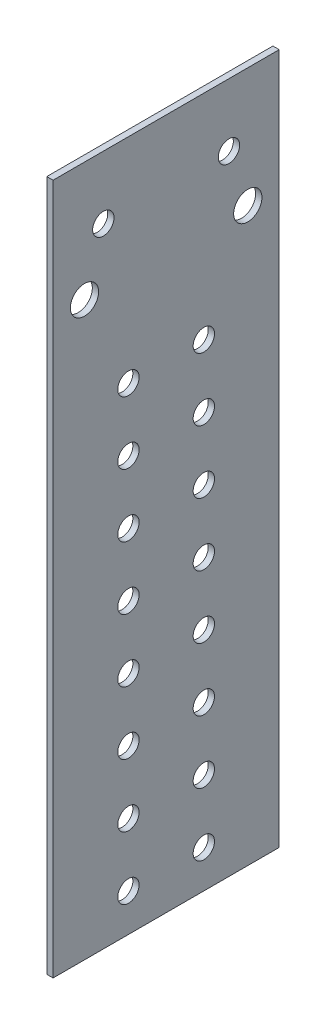
ISO-10303-21;
HEADER;
FILE_DESCRIPTION(('STEP AP214'),'2;1');
FILE_NAME('part.step','',(''),(''),'','','');
FILE_SCHEMA(('AUTOMOTIVE_DESIGN { 1 0 10303 214 1 1 1 1 }'));
ENDSEC;
DATA;
#1=APPLICATION_CONTEXT('core data for automotive mechanical design processes');
#2=APPLICATION_PROTOCOL_DEFINITION('international standard','automotive_design',2000,#1);
#3=PRODUCT_CONTEXT('',#1,'mechanical');
#4=PRODUCT('Part','Part','',(#3));
#5=PRODUCT_RELATED_PRODUCT_CATEGORY('part','',(#4));
#6=PRODUCT_DEFINITION_FORMATION('','',#4);
#7=PRODUCT_DEFINITION_CONTEXT('part definition',#1,'design');
#8=PRODUCT_DEFINITION('design','',#6,#7);
#9=PRODUCT_DEFINITION_SHAPE('','',#8);
#10=(LENGTH_UNIT() NAMED_UNIT(*) SI_UNIT(.MILLI.,.METRE.));
#11=(NAMED_UNIT(*) PLANE_ANGLE_UNIT() SI_UNIT($,.RADIAN.));
#12=(NAMED_UNIT(*) SI_UNIT($,.STERADIAN.) SOLID_ANGLE_UNIT());
#13=UNCERTAINTY_MEASURE_WITH_UNIT(LENGTH_MEASURE(1.E-05),#10,'distance_accuracy_value','');
#14=(GEOMETRIC_REPRESENTATION_CONTEXT(3) GLOBAL_UNCERTAINTY_ASSIGNED_CONTEXT((#13)) GLOBAL_UNIT_ASSIGNED_CONTEXT((#10,
#11,#12)) REPRESENTATION_CONTEXT('',''));
#15=CARTESIAN_POINT('',(0.,0.,0.));
#16=DIRECTION('',(0.,0.,1.));
#17=DIRECTION('',(1.,0.,0.));
#18=AXIS2_PLACEMENT_3D('',#15,#16,#17);
#19=CARTESIAN_POINT('',(1.,0.,18.));
#20=DIRECTION('',(0.,1.,0.));
#21=DIRECTION('',(0.,0.,1.));
#22=AXIS2_PLACEMENT_3D('',#19,#20,#21);
#23=PLANE('',#22);
#24=DIRECTION('',(0.,0.,-1.));
#25=VECTOR('',#24,1.);
#26=CARTESIAN_POINT('',(0.,0.,18.));
#27=LINE('',#26,#25);
#28=CARTESIAN_POINT('',(0.,0.,18.));
#29=VERTEX_POINT('',#28);
#30=CARTESIAN_POINT('',(0.,0.,-18.));
#31=VERTEX_POINT('',#30);
#32=EDGE_CURVE('E100',#29,#31,#27,.T.);
#33=ORIENTED_EDGE('',*,*,#32,.F.);
#34=DIRECTION('',(-1.,0.,0.));
#35=VECTOR('',#34,1.);
#36=CARTESIAN_POINT('',(1.,0.,18.));
#37=LINE('',#36,#35);
#38=CARTESIAN_POINT('',(1.,0.,18.));
#39=VERTEX_POINT('',#38);
#40=EDGE_CURVE('E11',#39,#29,#37,.T.);
#41=ORIENTED_EDGE('',*,*,#40,.F.);
#42=DIRECTION('',(0.,0.,-1.));
#43=VECTOR('',#42,1.);
#44=CARTESIAN_POINT('',(1.,0.,18.));
#45=LINE('',#44,#43);
#46=CARTESIAN_POINT('',(1.,0.,-18.));
#47=VERTEX_POINT('',#46);
#48=EDGE_CURVE('E94',#39,#47,#45,.T.);
#49=ORIENTED_EDGE('',*,*,#48,.T.);
#50=DIRECTION('',(-1.,0.,0.));
#51=VECTOR('',#50,1.);
#52=CARTESIAN_POINT('',(1.,0.,-18.));
#53=LINE('',#52,#51);
#54=EDGE_CURVE('E37',#47,#31,#53,.T.);
#55=ORIENTED_EDGE('',*,*,#54,.T.);
#56=EDGE_LOOP('',(#33,#41,#49,#55));
#57=FACE_BOUND('',#56,.T.);
#58=ADVANCED_FACE('F34',(#57),#23,.T.);
#59=CARTESIAN_POINT('',(1.,0.,18.));
#60=DIRECTION('',(0.,0.,-1.));
#61=DIRECTION('',(0.,1.,0.));
#62=AXIS2_PLACEMENT_3D('',#59,#60,#61);
#63=PLANE('',#62);
#64=DIRECTION('',(0.,-1.,0.));
#65=VECTOR('',#64,1.);
#66=CARTESIAN_POINT('',(0.,0.,18.));
#67=LINE('',#66,#65);
#68=CARTESIAN_POINT('',(0.,-110.,18.));
#69=VERTEX_POINT('',#68);
#70=EDGE_CURVE('E67',#29,#69,#67,.T.);
#71=ORIENTED_EDGE('',*,*,#70,.T.);
#72=DIRECTION('',(-1.,0.,0.));
#73=VECTOR('',#72,1.);
#74=CARTESIAN_POINT('',(1.,-110.,18.));
#75=LINE('',#74,#73);
#76=CARTESIAN_POINT('',(1.,-110.,18.));
#77=VERTEX_POINT('',#76);
#78=EDGE_CURVE('E43',#77,#69,#75,.T.);
#79=ORIENTED_EDGE('',*,*,#78,.F.);
#80=DIRECTION('',(0.,-1.,0.));
#81=VECTOR('',#80,1.);
#82=CARTESIAN_POINT('',(1.,0.,18.));
#83=LINE('',#82,#81);
#84=EDGE_CURVE('E84',#39,#77,#83,.T.);
#85=ORIENTED_EDGE('',*,*,#84,.F.);
#86=ORIENTED_EDGE('',*,*,#40,.T.);
#87=EDGE_LOOP('',(#71,#79,#85,#86));
#88=FACE_BOUND('',#87,.T.);
#89=ADVANCED_FACE('F111',(#88),#63,.F.);
#90=CARTESIAN_POINT('',(1.,-110.,18.));
#91=DIRECTION('',(0.,1.,0.));
#92=DIRECTION('',(0.,0.,1.));
#93=AXIS2_PLACEMENT_3D('',#90,#91,#92);
#94=PLANE('',#93);
#95=DIRECTION('',(0.,0.,-1.));
#96=VECTOR('',#95,1.);
#97=CARTESIAN_POINT('',(0.,-110.,18.));
#98=LINE('',#97,#96);
#99=CARTESIAN_POINT('',(0.,-110.,-18.));
#100=VERTEX_POINT('',#99);
#101=EDGE_CURVE('E91',#69,#100,#98,.T.);
#102=ORIENTED_EDGE('',*,*,#101,.T.);
#103=DIRECTION('',(-1.,0.,0.));
#104=VECTOR('',#103,1.);
#105=CARTESIAN_POINT('',(1.,-110.,-18.));
#106=LINE('',#105,#104);
#107=CARTESIAN_POINT('',(1.,-110.,-18.));
#108=VERTEX_POINT('',#107);
#109=EDGE_CURVE('E88',#108,#100,#106,.T.);
#110=ORIENTED_EDGE('',*,*,#109,.F.);
#111=DIRECTION('',(0.,0.,-1.));
#112=VECTOR('',#111,1.);
#113=CARTESIAN_POINT('',(1.,-110.,18.));
#114=LINE('',#113,#112);
#115=EDGE_CURVE('E79',#77,#108,#114,.T.);
#116=ORIENTED_EDGE('',*,*,#115,.F.);
#117=ORIENTED_EDGE('',*,*,#78,.T.);
#118=EDGE_LOOP('',(#102,#110,#116,#117));
#119=FACE_BOUND('',#118,.T.);
#120=ADVANCED_FACE('F89',(#119),#94,.F.);
#121=CARTESIAN_POINT('',(1.,0.,-18.));
#122=DIRECTION('',(0.,0.,-1.));
#123=DIRECTION('',(0.,1.,0.));
#124=AXIS2_PLACEMENT_3D('',#121,#122,#123);
#125=PLANE('',#124);
#126=DIRECTION('',(0.,-1.,0.));
#127=VECTOR('',#126,1.);
#128=CARTESIAN_POINT('',(0.,0.,-18.));
#129=LINE('',#128,#127);
#130=EDGE_CURVE('E103',#31,#100,#129,.T.);
#131=ORIENTED_EDGE('',*,*,#130,.F.);
#132=ORIENTED_EDGE('',*,*,#54,.F.);
#133=DIRECTION('',(0.,-1.,0.));
#134=VECTOR('',#133,1.);
#135=CARTESIAN_POINT('',(1.,0.,-18.));
#136=LINE('',#135,#134);
#137=EDGE_CURVE('E83',#47,#108,#136,.T.);
#138=ORIENTED_EDGE('',*,*,#137,.T.);
#139=ORIENTED_EDGE('',*,*,#109,.T.);
#140=EDGE_LOOP('',(#131,#132,#138,#139));
#141=FACE_BOUND('',#140,.T.);
#142=ADVANCED_FACE('F93',(#141),#125,.T.);
#143=CARTESIAN_POINT('',(1.,0.,0.));
#144=DIRECTION('',(-1.,0.,0.));
#145=DIRECTION('',(0.,0.,1.));
#146=AXIS2_PLACEMENT_3D('',#143,#144,#145);
#147=PLANE('',#146);
#148=CARTESIAN_POINT('',(1.,-104.,-6.00000000000038));
#149=DIRECTION('',(1.,0.,0.));
#150=DIRECTION('',(0.,0.,-1.));
#151=AXIS2_PLACEMENT_3D('',#148,#149,#150);
#152=CIRCLE('',#151,1.69999999999999);
#153=CARTESIAN_POINT('',(1.,-104.,-7.70000000000037));
#154=VERTEX_POINT('',#153);
#155=EDGE_CURVE('E220',#154,#154,#152,.T.);
#156=ORIENTED_EDGE('',*,*,#155,.F.);
#157=EDGE_LOOP('',(#156));
#158=FACE_BOUND('',#157,.T.);
#159=CARTESIAN_POINT('',(1.,-104.,5.99999999999962));
#160=DIRECTION('',(1.,0.,0.));
#161=DIRECTION('',(0.,0.,-1.));
#162=AXIS2_PLACEMENT_3D('',#159,#160,#161);
#163=CIRCLE('',#162,1.69999999999999);
#164=CARTESIAN_POINT('',(1.,-104.,4.29999999999963));
#165=VERTEX_POINT('',#164);
#166=EDGE_CURVE('E222',#165,#165,#163,.T.);
#167=ORIENTED_EDGE('',*,*,#166,.F.);
#168=EDGE_LOOP('',(#167));
#169=FACE_BOUND('',#168,.T.);
#170=CARTESIAN_POINT('',(1.,-94.,-6.00000000000034));
#171=DIRECTION('',(1.,0.,0.));
#172=DIRECTION('',(0.,0.,-1.));
#173=AXIS2_PLACEMENT_3D('',#170,#171,#172);
#174=CIRCLE('',#173,1.69999999999999);
#175=CARTESIAN_POINT('',(1.,-94.,-7.70000000000033));
#176=VERTEX_POINT('',#175);
#177=EDGE_CURVE('E230',#176,#176,#174,.T.);
#178=ORIENTED_EDGE('',*,*,#177,.F.);
#179=EDGE_LOOP('',(#178));
#180=FACE_BOUND('',#179,.T.);
#181=CARTESIAN_POINT('',(1.,-94.,5.99999999999966));
#182=DIRECTION('',(1.,0.,0.));
#183=DIRECTION('',(0.,0.,-1.));
#184=AXIS2_PLACEMENT_3D('',#181,#182,#183);
#185=CIRCLE('',#184,1.69999999999999);
#186=CARTESIAN_POINT('',(1.,-94.,4.29999999999967));
#187=VERTEX_POINT('',#186);
#188=EDGE_CURVE('E236',#187,#187,#185,.T.);
#189=ORIENTED_EDGE('',*,*,#188,.F.);
#190=EDGE_LOOP('',(#189));
#191=FACE_BOUND('',#190,.T.);
#192=CARTESIAN_POINT('',(1.,-84.,-6.00000000000031));
#193=DIRECTION('',(1.,0.,0.));
#194=DIRECTION('',(0.,0.,-1.));
#195=AXIS2_PLACEMENT_3D('',#192,#193,#194);
#196=CIRCLE('',#195,1.69999999999999);
#197=CARTESIAN_POINT('',(1.,-84.,-7.7000000000003));
#198=VERTEX_POINT('',#197);
#199=EDGE_CURVE('E242',#198,#198,#196,.T.);
#200=ORIENTED_EDGE('',*,*,#199,.F.);
#201=EDGE_LOOP('',(#200));
#202=FACE_BOUND('',#201,.T.);
#203=CARTESIAN_POINT('',(1.,-84.,5.99999999999969));
#204=DIRECTION('',(1.,0.,0.));
#205=DIRECTION('',(0.,0.,-1.));
#206=AXIS2_PLACEMENT_3D('',#203,#204,#205);
#207=CIRCLE('',#206,1.69999999999999);
#208=CARTESIAN_POINT('',(1.,-84.,4.2999999999997));
#209=VERTEX_POINT('',#208);
#210=EDGE_CURVE('E248',#209,#209,#207,.T.);
#211=ORIENTED_EDGE('',*,*,#210,.F.);
#212=EDGE_LOOP('',(#211));
#213=FACE_BOUND('',#212,.T.);
#214=CARTESIAN_POINT('',(1.,-74.,-6.00000000000027));
#215=DIRECTION('',(1.,0.,0.));
#216=DIRECTION('',(0.,0.,-1.));
#217=AXIS2_PLACEMENT_3D('',#214,#215,#216);
#218=CIRCLE('',#217,1.69999999999999);
#219=CARTESIAN_POINT('',(1.,-74.,-7.70000000000026));
#220=VERTEX_POINT('',#219);
#221=EDGE_CURVE('E254',#220,#220,#218,.T.);
#222=ORIENTED_EDGE('',*,*,#221,.F.);
#223=EDGE_LOOP('',(#222));
#224=FACE_BOUND('',#223,.T.);
#225=CARTESIAN_POINT('',(1.,-74.,5.99999999999973));
#226=DIRECTION('',(1.,0.,0.));
#227=DIRECTION('',(0.,0.,-1.));
#228=AXIS2_PLACEMENT_3D('',#225,#226,#227);
#229=CIRCLE('',#228,1.69999999999999);
#230=CARTESIAN_POINT('',(1.,-74.,4.29999999999974));
#231=VERTEX_POINT('',#230);
#232=EDGE_CURVE('E260',#231,#231,#229,.T.);
#233=ORIENTED_EDGE('',*,*,#232,.F.);
#234=EDGE_LOOP('',(#233));
#235=FACE_BOUND('',#234,.T.);
#236=CARTESIAN_POINT('',(1.,-64.,-6.00000000000024));
#237=DIRECTION('',(1.,0.,0.));
#238=DIRECTION('',(0.,0.,-1.));
#239=AXIS2_PLACEMENT_3D('',#236,#237,#238);
#240=CIRCLE('',#239,1.69999999999999);
#241=CARTESIAN_POINT('',(1.,-64.,-7.70000000000022));
#242=VERTEX_POINT('',#241);
#243=EDGE_CURVE('E266',#242,#242,#240,.T.);
#244=ORIENTED_EDGE('',*,*,#243,.F.);
#245=EDGE_LOOP('',(#244));
#246=FACE_BOUND('',#245,.T.);
#247=CARTESIAN_POINT('',(1.,-64.,5.99999999999976));
#248=DIRECTION('',(1.,0.,0.));
#249=DIRECTION('',(0.,0.,-1.));
#250=AXIS2_PLACEMENT_3D('',#247,#248,#249);
#251=CIRCLE('',#250,1.69999999999999);
#252=CARTESIAN_POINT('',(1.,-64.,4.29999999999978));
#253=VERTEX_POINT('',#252);
#254=EDGE_CURVE('E272',#253,#253,#251,.T.);
#255=ORIENTED_EDGE('',*,*,#254,.F.);
#256=EDGE_LOOP('',(#255));
#257=FACE_BOUND('',#256,.T.);
#258=CARTESIAN_POINT('',(1.,-54.,-6.0000000000002));
#259=DIRECTION('',(1.,0.,0.));
#260=DIRECTION('',(0.,0.,-1.));
#261=AXIS2_PLACEMENT_3D('',#258,#259,#260);
#262=CIRCLE('',#261,1.69999999999999);
#263=CARTESIAN_POINT('',(1.,-54.,-7.70000000000019));
#264=VERTEX_POINT('',#263);
#265=EDGE_CURVE('E278',#264,#264,#262,.T.);
#266=ORIENTED_EDGE('',*,*,#265,.F.);
#267=EDGE_LOOP('',(#266));
#268=FACE_BOUND('',#267,.T.);
#269=CARTESIAN_POINT('',(1.,-54.,5.9999999999998));
#270=DIRECTION('',(1.,0.,0.));
#271=DIRECTION('',(0.,0.,-1.));
#272=AXIS2_PLACEMENT_3D('',#269,#270,#271);
#273=CIRCLE('',#272,1.69999999999999);
#274=CARTESIAN_POINT('',(1.,-54.,4.29999999999981));
#275=VERTEX_POINT('',#274);
#276=EDGE_CURVE('E284',#275,#275,#273,.T.);
#277=ORIENTED_EDGE('',*,*,#276,.F.);
#278=EDGE_LOOP('',(#277));
#279=FACE_BOUND('',#278,.T.);
#280=CARTESIAN_POINT('',(1.,-44.,-6.00000000000017));
#281=DIRECTION('',(1.,0.,0.));
#282=DIRECTION('',(0.,0.,-1.));
#283=AXIS2_PLACEMENT_3D('',#280,#281,#282);
#284=CIRCLE('',#283,1.69999999999999);
#285=CARTESIAN_POINT('',(1.,-44.,-7.70000000000015));
#286=VERTEX_POINT('',#285);
#287=EDGE_CURVE('E290',#286,#286,#284,.T.);
#288=ORIENTED_EDGE('',*,*,#287,.F.);
#289=EDGE_LOOP('',(#288));
#290=FACE_BOUND('',#289,.T.);
#291=CARTESIAN_POINT('',(1.,-44.,5.99999999999983));
#292=DIRECTION('',(1.,0.,0.));
#293=DIRECTION('',(0.,0.,-1.));
#294=AXIS2_PLACEMENT_3D('',#291,#292,#293);
#295=CIRCLE('',#294,1.69999999999999);
#296=CARTESIAN_POINT('',(1.,-44.,4.29999999999985));
#297=VERTEX_POINT('',#296);
#298=EDGE_CURVE('E296',#297,#297,#295,.T.);
#299=ORIENTED_EDGE('',*,*,#298,.F.);
#300=EDGE_LOOP('',(#299));
#301=FACE_BOUND('',#300,.T.);
#302=CARTESIAN_POINT('',(1.,-34.,-6.00000000000013));
#303=DIRECTION('',(1.,0.,0.));
#304=DIRECTION('',(0.,0.,-1.));
#305=AXIS2_PLACEMENT_3D('',#302,#303,#304);
#306=CIRCLE('',#305,1.69999999999999);
#307=CARTESIAN_POINT('',(1.,-34.,-7.70000000000012));
#308=VERTEX_POINT('',#307);
#309=EDGE_CURVE('E302',#308,#308,#306,.T.);
#310=ORIENTED_EDGE('',*,*,#309,.F.);
#311=EDGE_LOOP('',(#310));
#312=FACE_BOUND('',#311,.T.);
#313=CARTESIAN_POINT('',(1.,-34.,5.99999999999987));
#314=DIRECTION('',(1.,0.,0.));
#315=DIRECTION('',(0.,0.,-1.));
#316=AXIS2_PLACEMENT_3D('',#313,#314,#315);
#317=CIRCLE('',#316,1.69999999999999);
#318=CARTESIAN_POINT('',(1.,-34.,4.29999999999988));
#319=VERTEX_POINT('',#318);
#320=EDGE_CURVE('E308',#319,#319,#317,.T.);
#321=ORIENTED_EDGE('',*,*,#320,.F.);
#322=EDGE_LOOP('',(#321));
#323=FACE_BOUND('',#322,.T.);
#324=CARTESIAN_POINT('',(1.,-19.,-13.));
#325=DIRECTION('',(-1.,0.,0.));
#326=DIRECTION('',(0.,0.,1.));
#327=AXIS2_PLACEMENT_3D('',#324,#325,#326);
#328=CIRCLE('',#327,2.25);
#329=CARTESIAN_POINT('',(1.,-19.,-10.75));
#330=VERTEX_POINT('',#329);
#331=EDGE_CURVE('E317',#330,#330,#328,.T.);
#332=ORIENTED_EDGE('',*,*,#331,.T.);
#333=EDGE_LOOP('',(#332));
#334=FACE_BOUND('',#333,.T.);
#335=CARTESIAN_POINT('',(1.,-19.,13.));
#336=DIRECTION('',(-1.,0.,0.));
#337=DIRECTION('',(0.,0.,1.));
#338=AXIS2_PLACEMENT_3D('',#335,#336,#337);
#339=CIRCLE('',#338,2.25);
#340=CARTESIAN_POINT('',(1.,-19.,15.25));
#341=VERTEX_POINT('',#340);
#342=EDGE_CURVE('E323',#341,#341,#339,.T.);
#343=ORIENTED_EDGE('',*,*,#342,.T.);
#344=EDGE_LOOP('',(#343));
#345=FACE_BOUND('',#344,.T.);
#346=CARTESIAN_POINT('',(1.,-10.,-9.99999999999999));
#347=DIRECTION('',(-1.,0.,0.));
#348=DIRECTION('',(0.,0.,1.));
#349=AXIS2_PLACEMENT_3D('',#346,#347,#348);
#350=CIRCLE('',#349,1.7);
#351=CARTESIAN_POINT('',(1.,-10.,-8.3));
#352=VERTEX_POINT('',#351);
#353=EDGE_CURVE('E329',#352,#352,#350,.T.);
#354=ORIENTED_EDGE('',*,*,#353,.T.);
#355=EDGE_LOOP('',(#354));
#356=FACE_BOUND('',#355,.T.);
#357=CARTESIAN_POINT('',(1.,-10.,10.));
#358=DIRECTION('',(-1.,0.,0.));
#359=DIRECTION('',(0.,0.,1.));
#360=AXIS2_PLACEMENT_3D('',#357,#358,#359);
#361=CIRCLE('',#360,1.7);
#362=CARTESIAN_POINT('',(1.,-10.,11.7));
#363=VERTEX_POINT('',#362);
#364=EDGE_CURVE('E104',#363,#363,#361,.T.);
#365=ORIENTED_EDGE('',*,*,#364,.T.);
#366=EDGE_LOOP('',(#365));
#367=FACE_BOUND('',#366,.T.);
#368=ORIENTED_EDGE('',*,*,#48,.F.);
#369=ORIENTED_EDGE('',*,*,#84,.T.);
#370=ORIENTED_EDGE('',*,*,#115,.T.);
#371=ORIENTED_EDGE('',*,*,#137,.F.);
#372=EDGE_LOOP('',(#368,#369,#370,#371));
#373=FACE_BOUND('',#372,.T.);
#374=ADVANCED_FACE('F82',(#158,#169,#180,#191,#202,#213,#224,#235,#246,#257,#268,#279,#290,#301,
#312,#323,#334,#345,#356,#367,#373),#147,.F.);
#375=CARTESIAN_POINT('',(0.,0.,0.));
#376=DIRECTION('',(-1.,0.,0.));
#377=DIRECTION('',(0.,0.,1.));
#378=AXIS2_PLACEMENT_3D('',#375,#376,#377);
#379=PLANE('',#378);
#380=CARTESIAN_POINT('',(0.,-104.,-6.00000000000038));
#381=DIRECTION('',(1.,0.,0.));
#382=DIRECTION('',(0.,0.,-1.));
#383=AXIS2_PLACEMENT_3D('',#380,#381,#382);
#384=CIRCLE('',#383,1.69999999999999);
#385=CARTESIAN_POINT('',(0.,-104.,-7.70000000000037));
#386=VERTEX_POINT('',#385);
#387=EDGE_CURVE('E218',#386,#386,#384,.T.);
#388=ORIENTED_EDGE('',*,*,#387,.T.);
#389=EDGE_LOOP('',(#388));
#390=FACE_BOUND('',#389,.T.);
#391=CARTESIAN_POINT('',(0.,-104.,5.99999999999962));
#392=DIRECTION('',(1.,0.,0.));
#393=DIRECTION('',(0.,0.,-1.));
#394=AXIS2_PLACEMENT_3D('',#391,#392,#393);
#395=CIRCLE('',#394,1.69999999999999);
#396=CARTESIAN_POINT('',(0.,-104.,4.29999999999963));
#397=VERTEX_POINT('',#396);
#398=EDGE_CURVE('E227',#397,#397,#395,.T.);
#399=ORIENTED_EDGE('',*,*,#398,.T.);
#400=EDGE_LOOP('',(#399));
#401=FACE_BOUND('',#400,.T.);
#402=CARTESIAN_POINT('',(0.,-94.,-6.00000000000034));
#403=DIRECTION('',(1.,0.,0.));
#404=DIRECTION('',(0.,0.,-1.));
#405=AXIS2_PLACEMENT_3D('',#402,#403,#404);
#406=CIRCLE('',#405,1.69999999999999);
#407=CARTESIAN_POINT('',(0.,-94.,-7.70000000000033));
#408=VERTEX_POINT('',#407);
#409=EDGE_CURVE('E233',#408,#408,#406,.T.);
#410=ORIENTED_EDGE('',*,*,#409,.T.);
#411=EDGE_LOOP('',(#410));
#412=FACE_BOUND('',#411,.T.);
#413=CARTESIAN_POINT('',(0.,-94.,5.99999999999966));
#414=DIRECTION('',(1.,0.,0.));
#415=DIRECTION('',(0.,0.,-1.));
#416=AXIS2_PLACEMENT_3D('',#413,#414,#415);
#417=CIRCLE('',#416,1.69999999999999);
#418=CARTESIAN_POINT('',(0.,-94.,4.29999999999967));
#419=VERTEX_POINT('',#418);
#420=EDGE_CURVE('E239',#419,#419,#417,.T.);
#421=ORIENTED_EDGE('',*,*,#420,.T.);
#422=EDGE_LOOP('',(#421));
#423=FACE_BOUND('',#422,.T.);
#424=CARTESIAN_POINT('',(0.,-84.,-6.00000000000031));
#425=DIRECTION('',(1.,0.,0.));
#426=DIRECTION('',(0.,0.,-1.));
#427=AXIS2_PLACEMENT_3D('',#424,#425,#426);
#428=CIRCLE('',#427,1.69999999999999);
#429=CARTESIAN_POINT('',(0.,-84.,-7.7000000000003));
#430=VERTEX_POINT('',#429);
#431=EDGE_CURVE('E245',#430,#430,#428,.T.);
#432=ORIENTED_EDGE('',*,*,#431,.T.);
#433=EDGE_LOOP('',(#432));
#434=FACE_BOUND('',#433,.T.);
#435=CARTESIAN_POINT('',(0.,-84.,5.99999999999969));
#436=DIRECTION('',(1.,0.,0.));
#437=DIRECTION('',(0.,0.,-1.));
#438=AXIS2_PLACEMENT_3D('',#435,#436,#437);
#439=CIRCLE('',#438,1.69999999999999);
#440=CARTESIAN_POINT('',(0.,-84.,4.2999999999997));
#441=VERTEX_POINT('',#440);
#442=EDGE_CURVE('E251',#441,#441,#439,.T.);
#443=ORIENTED_EDGE('',*,*,#442,.T.);
#444=EDGE_LOOP('',(#443));
#445=FACE_BOUND('',#444,.T.);
#446=CARTESIAN_POINT('',(0.,-74.,-6.00000000000027));
#447=DIRECTION('',(1.,0.,0.));
#448=DIRECTION('',(0.,0.,-1.));
#449=AXIS2_PLACEMENT_3D('',#446,#447,#448);
#450=CIRCLE('',#449,1.69999999999999);
#451=CARTESIAN_POINT('',(0.,-74.,-7.70000000000026));
#452=VERTEX_POINT('',#451);
#453=EDGE_CURVE('E257',#452,#452,#450,.T.);
#454=ORIENTED_EDGE('',*,*,#453,.T.);
#455=EDGE_LOOP('',(#454));
#456=FACE_BOUND('',#455,.T.);
#457=CARTESIAN_POINT('',(0.,-74.,5.99999999999973));
#458=DIRECTION('',(1.,0.,0.));
#459=DIRECTION('',(0.,0.,-1.));
#460=AXIS2_PLACEMENT_3D('',#457,#458,#459);
#461=CIRCLE('',#460,1.69999999999999);
#462=CARTESIAN_POINT('',(0.,-74.,4.29999999999974));
#463=VERTEX_POINT('',#462);
#464=EDGE_CURVE('E263',#463,#463,#461,.T.);
#465=ORIENTED_EDGE('',*,*,#464,.T.);
#466=EDGE_LOOP('',(#465));
#467=FACE_BOUND('',#466,.T.);
#468=CARTESIAN_POINT('',(0.,-64.,-6.00000000000024));
#469=DIRECTION('',(1.,0.,0.));
#470=DIRECTION('',(0.,0.,-1.));
#471=AXIS2_PLACEMENT_3D('',#468,#469,#470);
#472=CIRCLE('',#471,1.7);
#473=CARTESIAN_POINT('',(0.,-64.,-7.70000000000024));
#474=VERTEX_POINT('',#473);
#475=EDGE_CURVE('E269',#474,#474,#472,.T.);
#476=ORIENTED_EDGE('',*,*,#475,.T.);
#477=EDGE_LOOP('',(#476));
#478=FACE_BOUND('',#477,.T.);
#479=CARTESIAN_POINT('',(0.,-64.,5.99999999999976));
#480=DIRECTION('',(1.,0.,0.));
#481=DIRECTION('',(0.,0.,-1.));
#482=AXIS2_PLACEMENT_3D('',#479,#480,#481);
#483=CIRCLE('',#482,1.7);
#484=CARTESIAN_POINT('',(0.,-64.,4.29999999999976));
#485=VERTEX_POINT('',#484);
#486=EDGE_CURVE('E275',#485,#485,#483,.T.);
#487=ORIENTED_EDGE('',*,*,#486,.T.);
#488=EDGE_LOOP('',(#487));
#489=FACE_BOUND('',#488,.T.);
#490=CARTESIAN_POINT('',(0.,-54.,-6.0000000000002));
#491=DIRECTION('',(1.,0.,0.));
#492=DIRECTION('',(0.,0.,-1.));
#493=AXIS2_PLACEMENT_3D('',#490,#491,#492);
#494=CIRCLE('',#493,1.7);
#495=CARTESIAN_POINT('',(0.,-54.,-7.7000000000002));
#496=VERTEX_POINT('',#495);
#497=EDGE_CURVE('E281',#496,#496,#494,.T.);
#498=ORIENTED_EDGE('',*,*,#497,.T.);
#499=EDGE_LOOP('',(#498));
#500=FACE_BOUND('',#499,.T.);
#501=CARTESIAN_POINT('',(0.,-54.,5.9999999999998));
#502=DIRECTION('',(1.,0.,0.));
#503=DIRECTION('',(0.,0.,-1.));
#504=AXIS2_PLACEMENT_3D('',#501,#502,#503);
#505=CIRCLE('',#504,1.7);
#506=CARTESIAN_POINT('',(0.,-54.,4.2999999999998));
#507=VERTEX_POINT('',#506);
#508=EDGE_CURVE('E287',#507,#507,#505,.T.);
#509=ORIENTED_EDGE('',*,*,#508,.T.);
#510=EDGE_LOOP('',(#509));
#511=FACE_BOUND('',#510,.T.);
#512=CARTESIAN_POINT('',(0.,-44.,-6.00000000000017));
#513=DIRECTION('',(1.,0.,0.));
#514=DIRECTION('',(0.,0.,-1.));
#515=AXIS2_PLACEMENT_3D('',#512,#513,#514);
#516=CIRCLE('',#515,1.7);
#517=CARTESIAN_POINT('',(0.,-44.,-7.70000000000017));
#518=VERTEX_POINT('',#517);
#519=EDGE_CURVE('E293',#518,#518,#516,.T.);
#520=ORIENTED_EDGE('',*,*,#519,.T.);
#521=EDGE_LOOP('',(#520));
#522=FACE_BOUND('',#521,.T.);
#523=CARTESIAN_POINT('',(0.,-44.,5.99999999999983));
#524=DIRECTION('',(1.,0.,0.));
#525=DIRECTION('',(0.,0.,-1.));
#526=AXIS2_PLACEMENT_3D('',#523,#524,#525);
#527=CIRCLE('',#526,1.7);
#528=CARTESIAN_POINT('',(0.,-44.,4.29999999999983));
#529=VERTEX_POINT('',#528);
#530=EDGE_CURVE('E299',#529,#529,#527,.T.);
#531=ORIENTED_EDGE('',*,*,#530,.T.);
#532=EDGE_LOOP('',(#531));
#533=FACE_BOUND('',#532,.T.);
#534=CARTESIAN_POINT('',(0.,-34.,-6.00000000000013));
#535=DIRECTION('',(1.,0.,0.));
#536=DIRECTION('',(0.,0.,-1.));
#537=AXIS2_PLACEMENT_3D('',#534,#535,#536);
#538=CIRCLE('',#537,1.7);
#539=CARTESIAN_POINT('',(0.,-34.,-7.70000000000013));
#540=VERTEX_POINT('',#539);
#541=EDGE_CURVE('E305',#540,#540,#538,.T.);
#542=ORIENTED_EDGE('',*,*,#541,.T.);
#543=EDGE_LOOP('',(#542));
#544=FACE_BOUND('',#543,.T.);
#545=CARTESIAN_POINT('',(0.,-34.,5.99999999999987));
#546=DIRECTION('',(1.,0.,0.));
#547=DIRECTION('',(0.,0.,-1.));
#548=AXIS2_PLACEMENT_3D('',#545,#546,#547);
#549=CIRCLE('',#548,1.7);
#550=CARTESIAN_POINT('',(0.,-34.,4.29999999999987));
#551=VERTEX_POINT('',#550);
#552=EDGE_CURVE('E311',#551,#551,#549,.T.);
#553=ORIENTED_EDGE('',*,*,#552,.T.);
#554=EDGE_LOOP('',(#553));
#555=FACE_BOUND('',#554,.T.);
#556=CARTESIAN_POINT('',(0.,-19.,-13.));
#557=DIRECTION('',(-1.,0.,0.));
#558=DIRECTION('',(0.,0.,1.));
#559=AXIS2_PLACEMENT_3D('',#556,#557,#558);
#560=CIRCLE('',#559,2.25);
#561=CARTESIAN_POINT('',(0.,-19.,-10.75));
#562=VERTEX_POINT('',#561);
#563=EDGE_CURVE('E314',#562,#562,#560,.T.);
#564=ORIENTED_EDGE('',*,*,#563,.F.);
#565=EDGE_LOOP('',(#564));
#566=FACE_BOUND('',#565,.T.);
#567=CARTESIAN_POINT('',(0.,-19.,13.));
#568=DIRECTION('',(-1.,0.,0.));
#569=DIRECTION('',(0.,0.,1.));
#570=AXIS2_PLACEMENT_3D('',#567,#568,#569);
#571=CIRCLE('',#570,2.25);
#572=CARTESIAN_POINT('',(0.,-19.,15.25));
#573=VERTEX_POINT('',#572);
#574=EDGE_CURVE('E320',#573,#573,#571,.T.);
#575=ORIENTED_EDGE('',*,*,#574,.F.);
#576=EDGE_LOOP('',(#575));
#577=FACE_BOUND('',#576,.T.);
#578=CARTESIAN_POINT('',(0.,-10.,-9.99999999999999));
#579=DIRECTION('',(-1.,0.,0.));
#580=DIRECTION('',(0.,0.,1.));
#581=AXIS2_PLACEMENT_3D('',#578,#579,#580);
#582=CIRCLE('',#581,1.69999999999999);
#583=CARTESIAN_POINT('',(0.,-10.,-8.30000000000001));
#584=VERTEX_POINT('',#583);
#585=EDGE_CURVE('E326',#584,#584,#582,.T.);
#586=ORIENTED_EDGE('',*,*,#585,.F.);
#587=EDGE_LOOP('',(#586));
#588=FACE_BOUND('',#587,.T.);
#589=CARTESIAN_POINT('',(0.,-10.,10.));
#590=DIRECTION('',(-1.,0.,0.));
#591=DIRECTION('',(0.,0.,1.));
#592=AXIS2_PLACEMENT_3D('',#589,#590,#591);
#593=CIRCLE('',#592,1.69999999999999);
#594=CARTESIAN_POINT('',(0.,-10.,11.7));
#595=VERTEX_POINT('',#594);
#596=EDGE_CURVE('E332',#595,#595,#593,.T.);
#597=ORIENTED_EDGE('',*,*,#596,.F.);
#598=EDGE_LOOP('',(#597));
#599=FACE_BOUND('',#598,.T.);
#600=ORIENTED_EDGE('',*,*,#32,.T.);
#601=ORIENTED_EDGE('',*,*,#130,.T.);
#602=ORIENTED_EDGE('',*,*,#101,.F.);
#603=ORIENTED_EDGE('',*,*,#70,.F.);
#604=EDGE_LOOP('',(#600,#601,#602,#603));
#605=FACE_BOUND('',#604,.T.);
#606=ADVANCED_FACE('F109',(#390,#401,#412,#423,#434,#445,#456,#467,#478,#489,#500,#511,#522,
#533,#544,#555,#566,#577,#588,#599,#605),#379,.T.);
#607=CARTESIAN_POINT('',(0.,-10.,10.));
#608=DIRECTION('',(-1.,0.,0.));
#609=DIRECTION('',(0.,0.,1.));
#610=AXIS2_PLACEMENT_3D('',#607,#608,#609);
#611=CYLINDRICAL_SURFACE('',#610,1.69999999999999);
#612=ORIENTED_EDGE('',*,*,#364,.F.);
#613=EDGE_LOOP('',(#612));
#614=FACE_BOUND('',#613,.T.);
#615=ORIENTED_EDGE('',*,*,#596,.T.);
#616=EDGE_LOOP('',(#615));
#617=FACE_BOUND('',#616,.T.);
#618=ADVANCED_FACE('F130',(#614,#617),#611,.F.);
#619=CARTESIAN_POINT('',(0.,-10.,-9.99999999999999));
#620=DIRECTION('',(-1.,0.,0.));
#621=DIRECTION('',(0.,0.,1.));
#622=AXIS2_PLACEMENT_3D('',#619,#620,#621);
#623=CYLINDRICAL_SURFACE('',#622,1.69999999999999);
#624=ORIENTED_EDGE('',*,*,#353,.F.);
#625=EDGE_LOOP('',(#624));
#626=FACE_BOUND('',#625,.T.);
#627=ORIENTED_EDGE('',*,*,#585,.T.);
#628=EDGE_LOOP('',(#627));
#629=FACE_BOUND('',#628,.T.);
#630=ADVANCED_FACE('F137',(#626,#629),#623,.F.);
#631=CARTESIAN_POINT('',(0.,-19.,13.));
#632=DIRECTION('',(-1.,0.,0.));
#633=DIRECTION('',(0.,0.,1.));
#634=AXIS2_PLACEMENT_3D('',#631,#632,#633);
#635=CYLINDRICAL_SURFACE('',#634,2.25);
#636=ORIENTED_EDGE('',*,*,#342,.F.);
#637=EDGE_LOOP('',(#636));
#638=FACE_BOUND('',#637,.T.);
#639=ORIENTED_EDGE('',*,*,#574,.T.);
#640=EDGE_LOOP('',(#639));
#641=FACE_BOUND('',#640,.T.);
#642=ADVANCED_FACE('F141',(#638,#641),#635,.F.);
#643=CARTESIAN_POINT('',(0.,-19.,-13.));
#644=DIRECTION('',(-1.,0.,0.));
#645=DIRECTION('',(0.,0.,1.));
#646=AXIS2_PLACEMENT_3D('',#643,#644,#645);
#647=CYLINDRICAL_SURFACE('',#646,2.25);
#648=ORIENTED_EDGE('',*,*,#331,.F.);
#649=EDGE_LOOP('',(#648));
#650=FACE_BOUND('',#649,.T.);
#651=ORIENTED_EDGE('',*,*,#563,.T.);
#652=EDGE_LOOP('',(#651));
#653=FACE_BOUND('',#652,.T.);
#654=ADVANCED_FACE('F145',(#650,#653),#647,.F.);
#655=CARTESIAN_POINT('',(1.,-34.,5.99999999999987));
#656=DIRECTION('',(1.,0.,0.));
#657=DIRECTION('',(0.,0.,-1.));
#658=AXIS2_PLACEMENT_3D('',#655,#656,#657);
#659=CYLINDRICAL_SURFACE('',#658,1.69999999999999);
#660=ORIENTED_EDGE('',*,*,#552,.F.);
#661=EDGE_LOOP('',(#660));
#662=FACE_BOUND('',#661,.T.);
#663=ORIENTED_EDGE('',*,*,#320,.T.);
#664=EDGE_LOOP('',(#663));
#665=FACE_BOUND('',#664,.T.);
#666=ADVANCED_FACE('F149',(#662,#665),#659,.F.);
#667=CARTESIAN_POINT('',(1.,-34.,-6.00000000000013));
#668=DIRECTION('',(1.,0.,0.));
#669=DIRECTION('',(0.,0.,-1.));
#670=AXIS2_PLACEMENT_3D('',#667,#668,#669);
#671=CYLINDRICAL_SURFACE('',#670,1.69999999999999);
#672=ORIENTED_EDGE('',*,*,#541,.F.);
#673=EDGE_LOOP('',(#672));
#674=FACE_BOUND('',#673,.T.);
#675=ORIENTED_EDGE('',*,*,#309,.T.);
#676=EDGE_LOOP('',(#675));
#677=FACE_BOUND('',#676,.T.);
#678=ADVANCED_FACE('F153',(#674,#677),#671,.F.);
#679=CARTESIAN_POINT('',(1.,-44.,5.99999999999983));
#680=DIRECTION('',(1.,0.,0.));
#681=DIRECTION('',(0.,0.,-1.));
#682=AXIS2_PLACEMENT_3D('',#679,#680,#681);
#683=CYLINDRICAL_SURFACE('',#682,1.69999999999999);
#684=ORIENTED_EDGE('',*,*,#530,.F.);
#685=EDGE_LOOP('',(#684));
#686=FACE_BOUND('',#685,.T.);
#687=ORIENTED_EDGE('',*,*,#298,.T.);
#688=EDGE_LOOP('',(#687));
#689=FACE_BOUND('',#688,.T.);
#690=ADVANCED_FACE('F157',(#686,#689),#683,.F.);
#691=CARTESIAN_POINT('',(1.,-44.,-6.00000000000017));
#692=DIRECTION('',(1.,0.,0.));
#693=DIRECTION('',(0.,0.,-1.));
#694=AXIS2_PLACEMENT_3D('',#691,#692,#693);
#695=CYLINDRICAL_SURFACE('',#694,1.69999999999999);
#696=ORIENTED_EDGE('',*,*,#519,.F.);
#697=EDGE_LOOP('',(#696));
#698=FACE_BOUND('',#697,.T.);
#699=ORIENTED_EDGE('',*,*,#287,.T.);
#700=EDGE_LOOP('',(#699));
#701=FACE_BOUND('',#700,.T.);
#702=ADVANCED_FACE('F161',(#698,#701),#695,.F.);
#703=CARTESIAN_POINT('',(1.,-54.,5.9999999999998));
#704=DIRECTION('',(1.,0.,0.));
#705=DIRECTION('',(0.,0.,-1.));
#706=AXIS2_PLACEMENT_3D('',#703,#704,#705);
#707=CYLINDRICAL_SURFACE('',#706,1.69999999999999);
#708=ORIENTED_EDGE('',*,*,#508,.F.);
#709=EDGE_LOOP('',(#708));
#710=FACE_BOUND('',#709,.T.);
#711=ORIENTED_EDGE('',*,*,#276,.T.);
#712=EDGE_LOOP('',(#711));
#713=FACE_BOUND('',#712,.T.);
#714=ADVANCED_FACE('F165',(#710,#713),#707,.F.);
#715=CARTESIAN_POINT('',(1.,-54.,-6.0000000000002));
#716=DIRECTION('',(1.,0.,0.));
#717=DIRECTION('',(0.,0.,-1.));
#718=AXIS2_PLACEMENT_3D('',#715,#716,#717);
#719=CYLINDRICAL_SURFACE('',#718,1.69999999999999);
#720=ORIENTED_EDGE('',*,*,#497,.F.);
#721=EDGE_LOOP('',(#720));
#722=FACE_BOUND('',#721,.T.);
#723=ORIENTED_EDGE('',*,*,#265,.T.);
#724=EDGE_LOOP('',(#723));
#725=FACE_BOUND('',#724,.T.);
#726=ADVANCED_FACE('F169',(#722,#725),#719,.F.);
#727=CARTESIAN_POINT('',(1.,-64.,5.99999999999976));
#728=DIRECTION('',(1.,0.,0.));
#729=DIRECTION('',(0.,0.,-1.));
#730=AXIS2_PLACEMENT_3D('',#727,#728,#729);
#731=CYLINDRICAL_SURFACE('',#730,1.69999999999999);
#732=ORIENTED_EDGE('',*,*,#486,.F.);
#733=EDGE_LOOP('',(#732));
#734=FACE_BOUND('',#733,.T.);
#735=ORIENTED_EDGE('',*,*,#254,.T.);
#736=EDGE_LOOP('',(#735));
#737=FACE_BOUND('',#736,.T.);
#738=ADVANCED_FACE('F173',(#734,#737),#731,.F.);
#739=CARTESIAN_POINT('',(1.,-64.,-6.00000000000024));
#740=DIRECTION('',(1.,0.,0.));
#741=DIRECTION('',(0.,0.,-1.));
#742=AXIS2_PLACEMENT_3D('',#739,#740,#741);
#743=CYLINDRICAL_SURFACE('',#742,1.69999999999999);
#744=ORIENTED_EDGE('',*,*,#475,.F.);
#745=EDGE_LOOP('',(#744));
#746=FACE_BOUND('',#745,.T.);
#747=ORIENTED_EDGE('',*,*,#243,.T.);
#748=EDGE_LOOP('',(#747));
#749=FACE_BOUND('',#748,.T.);
#750=ADVANCED_FACE('F177',(#746,#749),#743,.F.);
#751=CARTESIAN_POINT('',(1.,-74.,5.99999999999973));
#752=DIRECTION('',(1.,0.,0.));
#753=DIRECTION('',(0.,0.,-1.));
#754=AXIS2_PLACEMENT_3D('',#751,#752,#753);
#755=CYLINDRICAL_SURFACE('',#754,1.69999999999999);
#756=ORIENTED_EDGE('',*,*,#464,.F.);
#757=EDGE_LOOP('',(#756));
#758=FACE_BOUND('',#757,.T.);
#759=ORIENTED_EDGE('',*,*,#232,.T.);
#760=EDGE_LOOP('',(#759));
#761=FACE_BOUND('',#760,.T.);
#762=ADVANCED_FACE('F181',(#758,#761),#755,.F.);
#763=CARTESIAN_POINT('',(1.,-74.,-6.00000000000027));
#764=DIRECTION('',(1.,0.,0.));
#765=DIRECTION('',(0.,0.,-1.));
#766=AXIS2_PLACEMENT_3D('',#763,#764,#765);
#767=CYLINDRICAL_SURFACE('',#766,1.69999999999999);
#768=ORIENTED_EDGE('',*,*,#453,.F.);
#769=EDGE_LOOP('',(#768));
#770=FACE_BOUND('',#769,.T.);
#771=ORIENTED_EDGE('',*,*,#221,.T.);
#772=EDGE_LOOP('',(#771));
#773=FACE_BOUND('',#772,.T.);
#774=ADVANCED_FACE('F185',(#770,#773),#767,.F.);
#775=CARTESIAN_POINT('',(1.,-84.,5.99999999999969));
#776=DIRECTION('',(1.,0.,0.));
#777=DIRECTION('',(0.,0.,-1.));
#778=AXIS2_PLACEMENT_3D('',#775,#776,#777);
#779=CYLINDRICAL_SURFACE('',#778,1.69999999999999);
#780=ORIENTED_EDGE('',*,*,#442,.F.);
#781=EDGE_LOOP('',(#780));
#782=FACE_BOUND('',#781,.T.);
#783=ORIENTED_EDGE('',*,*,#210,.T.);
#784=EDGE_LOOP('',(#783));
#785=FACE_BOUND('',#784,.T.);
#786=ADVANCED_FACE('F189',(#782,#785),#779,.F.);
#787=CARTESIAN_POINT('',(1.,-84.,-6.00000000000031));
#788=DIRECTION('',(1.,0.,0.));
#789=DIRECTION('',(0.,0.,-1.));
#790=AXIS2_PLACEMENT_3D('',#787,#788,#789);
#791=CYLINDRICAL_SURFACE('',#790,1.69999999999999);
#792=ORIENTED_EDGE('',*,*,#431,.F.);
#793=EDGE_LOOP('',(#792));
#794=FACE_BOUND('',#793,.T.);
#795=ORIENTED_EDGE('',*,*,#199,.T.);
#796=EDGE_LOOP('',(#795));
#797=FACE_BOUND('',#796,.T.);
#798=ADVANCED_FACE('F193',(#794,#797),#791,.F.);
#799=CARTESIAN_POINT('',(1.,-94.,5.99999999999966));
#800=DIRECTION('',(1.,0.,0.));
#801=DIRECTION('',(0.,0.,-1.));
#802=AXIS2_PLACEMENT_3D('',#799,#800,#801);
#803=CYLINDRICAL_SURFACE('',#802,1.69999999999999);
#804=ORIENTED_EDGE('',*,*,#420,.F.);
#805=EDGE_LOOP('',(#804));
#806=FACE_BOUND('',#805,.T.);
#807=ORIENTED_EDGE('',*,*,#188,.T.);
#808=EDGE_LOOP('',(#807));
#809=FACE_BOUND('',#808,.T.);
#810=ADVANCED_FACE('F197',(#806,#809),#803,.F.);
#811=CARTESIAN_POINT('',(1.,-94.,-6.00000000000034));
#812=DIRECTION('',(1.,0.,0.));
#813=DIRECTION('',(0.,0.,-1.));
#814=AXIS2_PLACEMENT_3D('',#811,#812,#813);
#815=CYLINDRICAL_SURFACE('',#814,1.69999999999999);
#816=ORIENTED_EDGE('',*,*,#409,.F.);
#817=EDGE_LOOP('',(#816));
#818=FACE_BOUND('',#817,.T.);
#819=ORIENTED_EDGE('',*,*,#177,.T.);
#820=EDGE_LOOP('',(#819));
#821=FACE_BOUND('',#820,.T.);
#822=ADVANCED_FACE('F201',(#818,#821),#815,.F.);
#823=CARTESIAN_POINT('',(1.,-104.,5.99999999999962));
#824=DIRECTION('',(1.,0.,0.));
#825=DIRECTION('',(0.,0.,-1.));
#826=AXIS2_PLACEMENT_3D('',#823,#824,#825);
#827=CYLINDRICAL_SURFACE('',#826,1.69999999999999);
#828=ORIENTED_EDGE('',*,*,#398,.F.);
#829=EDGE_LOOP('',(#828));
#830=FACE_BOUND('',#829,.T.);
#831=ORIENTED_EDGE('',*,*,#166,.T.);
#832=EDGE_LOOP('',(#831));
#833=FACE_BOUND('',#832,.T.);
#834=ADVANCED_FACE('F205',(#830,#833),#827,.F.);
#835=CARTESIAN_POINT('',(1.,-104.,-6.00000000000038));
#836=DIRECTION('',(1.,0.,0.));
#837=DIRECTION('',(0.,0.,-1.));
#838=AXIS2_PLACEMENT_3D('',#835,#836,#837);
#839=CYLINDRICAL_SURFACE('',#838,1.69999999999999);
#840=ORIENTED_EDGE('',*,*,#387,.F.);
#841=EDGE_LOOP('',(#840));
#842=FACE_BOUND('',#841,.T.);
#843=ORIENTED_EDGE('',*,*,#155,.T.);
#844=EDGE_LOOP('',(#843));
#845=FACE_BOUND('',#844,.T.);
#846=ADVANCED_FACE('F209',(#842,#845),#839,.F.);
#847=CLOSED_SHELL('',(#58,#89,#120,#142,#374,#606,#618,#630,#642,#654,#666,#678,#690,#702,#714,
#726,#738,#750,#762,#774,#786,#798,#810,#822,#834,#846));
#848=MANIFOLD_SOLID_BREP('B2',#847);
#849=ADVANCED_BREP_SHAPE_REPRESENTATION('',(#18,#848),#14);
#850=SHAPE_DEFINITION_REPRESENTATION(#9,#849);
ENDSEC;
END-ISO-10303-21;
